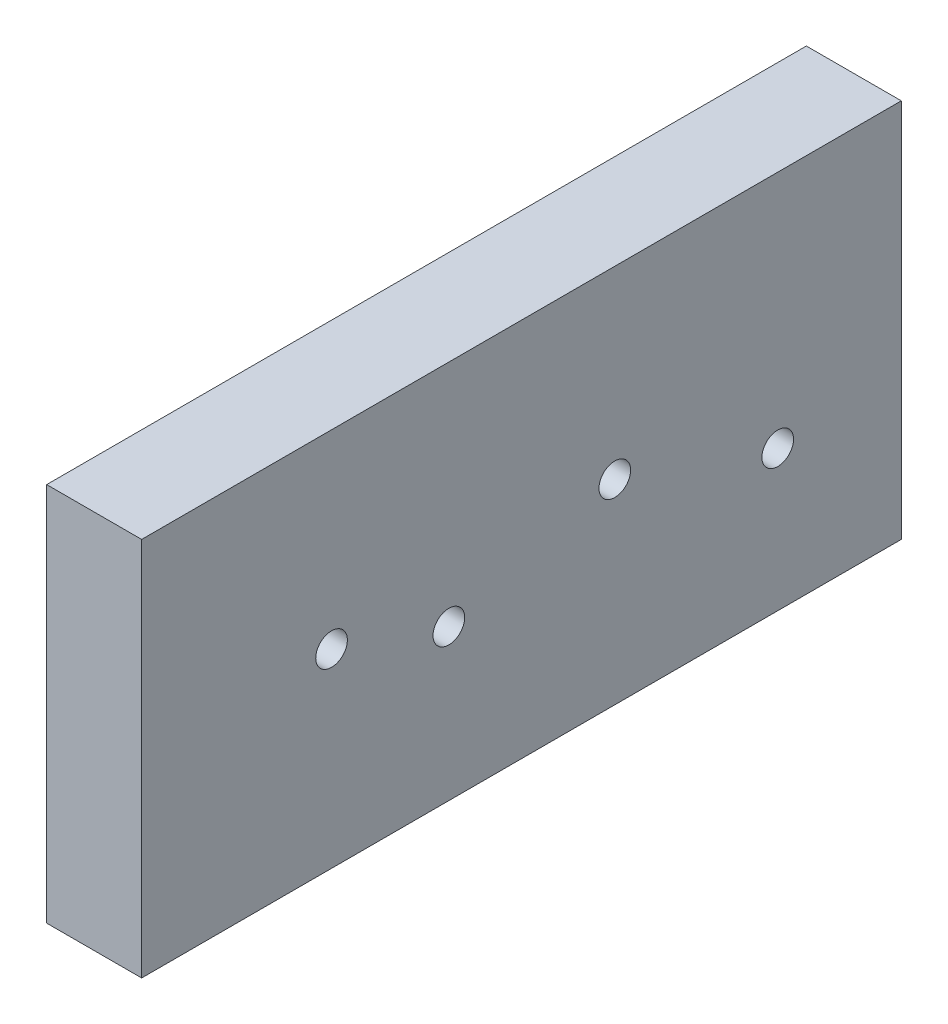
ISO-10303-21;
HEADER;
FILE_DESCRIPTION(('STEP AP214'),'2;1');
FILE_NAME('part.step','',(''),(''),'','','');
FILE_SCHEMA(('AUTOMOTIVE_DESIGN { 1 0 10303 214 1 1 1 1 }'));
ENDSEC;
DATA;
#1=APPLICATION_CONTEXT('core data for automotive mechanical design processes');
#2=APPLICATION_PROTOCOL_DEFINITION('international standard','automotive_design',2000,#1);
#3=PRODUCT_CONTEXT('',#1,'mechanical');
#4=PRODUCT('Part','Part','',(#3));
#5=PRODUCT_RELATED_PRODUCT_CATEGORY('part','',(#4));
#6=PRODUCT_DEFINITION_FORMATION('','',#4);
#7=PRODUCT_DEFINITION_CONTEXT('part definition',#1,'design');
#8=PRODUCT_DEFINITION('design','',#6,#7);
#9=PRODUCT_DEFINITION_SHAPE('','',#8);
#10=(LENGTH_UNIT() NAMED_UNIT(*) SI_UNIT(.MILLI.,.METRE.));
#11=(NAMED_UNIT(*) PLANE_ANGLE_UNIT() SI_UNIT($,.RADIAN.));
#12=(NAMED_UNIT(*) SI_UNIT($,.STERADIAN.) SOLID_ANGLE_UNIT());
#13=UNCERTAINTY_MEASURE_WITH_UNIT(LENGTH_MEASURE(1.E-05),#10,'distance_accuracy_value','');
#14=(GEOMETRIC_REPRESENTATION_CONTEXT(3) GLOBAL_UNCERTAINTY_ASSIGNED_CONTEXT((#13)) GLOBAL_UNIT_ASSIGNED_CONTEXT((#10,
#11,#12)) REPRESENTATION_CONTEXT('',''));
#15=CARTESIAN_POINT('',(0.,0.,0.));
#16=DIRECTION('',(0.,0.,1.));
#17=DIRECTION('',(1.,0.,0.));
#18=AXIS2_PLACEMENT_3D('',#15,#16,#17);
#19=CARTESIAN_POINT('',(19.05,-9.873506971,-51.4082559918149));
#20=DIRECTION('',(-1.,0.,0.));
#21=DIRECTION('',(0.,0.,1.));
#22=AXIS2_PLACEMENT_3D('',#19,#20,#21);
#23=CYLINDRICAL_SURFACE('',#22,3.175);
#24=CARTESIAN_POINT('',(19.05,-9.873506971,-51.4082559918149));
#25=DIRECTION('',(1.,0.,0.));
#26=DIRECTION('',(0.,0.,-1.));
#27=AXIS2_PLACEMENT_3D('',#24,#25,#26);
#28=CIRCLE('',#27,3.175);
#29=CARTESIAN_POINT('',(19.05,-9.873506971,-48.2332559918149));
#30=VERTEX_POINT('',#29);
#31=EDGE_CURVE('E193',#30,#30,#28,.T.);
#32=CARTESIAN_POINT('',(6.35,-9.873506971,-51.4082559918149));
#33=DIRECTION('',(-1.,0.,0.));
#34=DIRECTION('',(0.,0.,1.));
#35=AXIS2_PLACEMENT_3D('',#32,#33,#34);
#36=CIRCLE('',#35,3.175);
#37=CARTESIAN_POINT('',(6.35,-9.873506971,-48.2332559918149));
#38=VERTEX_POINT('',#37);
#39=EDGE_CURVE('E53',#38,#38,#36,.T.);
#40=CARTESIAN_POINT('',(19.05,-9.873506971,-48.2332559918149));
#41=CARTESIAN_POINT('',(18.9177083333333,-9.873506971,-48.2332559918149));
#42=CARTESIAN_POINT('',(18.7854166666667,-9.873506971,-48.2332559918149));
#43=CARTESIAN_POINT('',(18.5208333333333,-9.873506971,-48.2332559918149));
#44=CARTESIAN_POINT('',(18.3885416666667,-9.873506971,-48.2332559918149));
#45=CARTESIAN_POINT('',(18.1239583333333,-9.873506971,-48.2332559918149));
#46=CARTESIAN_POINT('',(17.9916666666667,-9.873506971,-48.2332559918149));
#47=CARTESIAN_POINT('',(17.7270833333333,-9.873506971,-48.2332559918149));
#48=CARTESIAN_POINT('',(17.5947916666667,-9.873506971,-48.2332559918149));
#49=CARTESIAN_POINT('',(17.3302083333333,-9.873506971,-48.2332559918149));
#50=CARTESIAN_POINT('',(17.1979166666667,-9.873506971,-48.2332559918149));
#51=CARTESIAN_POINT('',(16.9333333333333,-9.873506971,-48.2332559918149));
#52=CARTESIAN_POINT('',(16.8010416666667,-9.873506971,-48.2332559918149));
#53=CARTESIAN_POINT('',(16.5364583333333,-9.873506971,-48.2332559918149));
#54=CARTESIAN_POINT('',(16.4041666666667,-9.873506971,-48.2332559918149));
#55=CARTESIAN_POINT('',(16.1395833333333,-9.873506971,-48.2332559918149));
#56=CARTESIAN_POINT('',(16.0072916666667,-9.873506971,-48.2332559918149));
#57=CARTESIAN_POINT('',(15.7427083333333,-9.873506971,-48.2332559918149));
#58=CARTESIAN_POINT('',(15.6104166666667,-9.873506971,-48.2332559918149));
#59=CARTESIAN_POINT('',(15.3458333333333,-9.873506971,-48.2332559918149));
#60=CARTESIAN_POINT('',(15.2135416666667,-9.873506971,-48.2332559918149));
#61=CARTESIAN_POINT('',(14.9489583333333,-9.873506971,-48.2332559918149));
#62=CARTESIAN_POINT('',(14.8166666666667,-9.873506971,-48.2332559918149));
#63=CARTESIAN_POINT('',(14.5520833333333,-9.873506971,-48.2332559918149));
#64=CARTESIAN_POINT('',(14.4197916666667,-9.873506971,-48.2332559918149));
#65=CARTESIAN_POINT('',(14.1552083333333,-9.873506971,-48.2332559918149));
#66=CARTESIAN_POINT('',(14.0229166666667,-9.873506971,-48.2332559918149));
#67=CARTESIAN_POINT('',(13.7583333333333,-9.873506971,-48.2332559918149));
#68=CARTESIAN_POINT('',(13.6260416666667,-9.873506971,-48.2332559918149));
#69=CARTESIAN_POINT('',(13.3614583333333,-9.873506971,-48.2332559918149));
#70=CARTESIAN_POINT('',(13.2291666666667,-9.873506971,-48.2332559918149));
#71=CARTESIAN_POINT('',(12.9645833333333,-9.873506971,-48.2332559918149));
#72=CARTESIAN_POINT('',(12.8322916666667,-9.873506971,-48.2332559918149));
#73=CARTESIAN_POINT('',(12.5677083333333,-9.873506971,-48.2332559918149));
#74=CARTESIAN_POINT('',(12.4354166666667,-9.873506971,-48.2332559918149));
#75=CARTESIAN_POINT('',(12.1708333333333,-9.873506971,-48.2332559918149));
#76=CARTESIAN_POINT('',(12.0385416666667,-9.873506971,-48.2332559918149));
#77=CARTESIAN_POINT('',(11.7739583333333,-9.873506971,-48.2332559918149));
#78=CARTESIAN_POINT('',(11.6416666666667,-9.873506971,-48.2332559918149));
#79=CARTESIAN_POINT('',(11.3770833333333,-9.873506971,-48.2332559918149));
#80=CARTESIAN_POINT('',(11.2447916666667,-9.873506971,-48.2332559918149));
#81=CARTESIAN_POINT('',(10.9802083333333,-9.873506971,-48.2332559918149));
#82=CARTESIAN_POINT('',(10.8479166666667,-9.873506971,-48.2332559918149));
#83=CARTESIAN_POINT('',(10.5833333333333,-9.873506971,-48.2332559918149));
#84=CARTESIAN_POINT('',(10.4510416666667,-9.873506971,-48.2332559918149));
#85=CARTESIAN_POINT('',(10.1864583333333,-9.873506971,-48.2332559918149));
#86=CARTESIAN_POINT('',(10.0541666666667,-9.873506971,-48.2332559918149));
#87=CARTESIAN_POINT('',(9.78958333333333,-9.873506971,-48.2332559918149));
#88=CARTESIAN_POINT('',(9.65729166666667,-9.873506971,-48.2332559918149));
#89=CARTESIAN_POINT('',(9.39270833333333,-9.873506971,-48.2332559918149));
#90=CARTESIAN_POINT('',(9.26041666666667,-9.873506971,-48.2332559918149));
#91=CARTESIAN_POINT('',(8.99583333333333,-9.873506971,-48.2332559918149));
#92=CARTESIAN_POINT('',(8.86354166666667,-9.873506971,-48.2332559918149));
#93=CARTESIAN_POINT('',(8.59895833333333,-9.873506971,-48.2332559918149));
#94=CARTESIAN_POINT('',(8.46666666666667,-9.873506971,-48.2332559918149));
#95=CARTESIAN_POINT('',(8.20208333333333,-9.873506971,-48.2332559918149));
#96=CARTESIAN_POINT('',(8.06979166666667,-9.873506971,-48.2332559918149));
#97=CARTESIAN_POINT('',(7.80520833333333,-9.873506971,-48.2332559918149));
#98=CARTESIAN_POINT('',(7.67291666666667,-9.873506971,-48.2332559918149));
#99=CARTESIAN_POINT('',(7.40833333333333,-9.873506971,-48.2332559918149));
#100=CARTESIAN_POINT('',(7.27604166666667,-9.873506971,-48.2332559918149));
#101=CARTESIAN_POINT('',(7.01145833333333,-9.873506971,-48.2332559918149));
#102=CARTESIAN_POINT('',(6.87916666666667,-9.873506971,-48.2332559918149));
#103=CARTESIAN_POINT('',(6.61458333333333,-9.873506971,-48.2332559918149));
#104=CARTESIAN_POINT('',(6.48229166666667,-9.873506971,-48.2332559918149));
#105=CARTESIAN_POINT('',(6.35,-9.873506971,-48.2332559918149));
#106=B_SPLINE_CURVE_WITH_KNOTS('',3,(#40,#41,#42,#43,#44,#45,#46,#47,#48,#49,#50,#51,#52,#53,
#54,#55,#56,#57,#58,#59,#60,#61,#62,#63,#64,#65,#66,#67,#68,#69,#70,#71,#72,#73,#74,#75,#76,#77,
#78,#79,#80,#81,#82,#83,#84,#85,#86,#87,#88,#89,#90,#91,#92,#93,#94,#95,#96,#97,#98,#99,#100,
#101,#102,#103,#104,#105),.UNSPECIFIED.,.F.,.F.,(4,2,2,2,2,2,2,2,2,2,2,2,2,2,2,2,2,2,2,2,2,2,2,
2,2,2,2,2,2,2,2,2,4),(0.,0.396874999999998,0.793749999999999,1.190625,1.5875,1.984375,2.38125,
2.778125,3.175,3.571875,3.96875,4.365625,4.7625,5.159375,5.55625,5.953125,6.35,6.746875,7.14375,
7.540625,7.9375,8.334375,8.73125,9.128125,9.525,9.921875,10.31875,10.715625,11.1125,11.509375,
11.90625,12.303125,12.7),.UNSPECIFIED.);
#107=EDGE_CURVE('BSEAM49',#30,#38,#106,.T.);
#108=ORIENTED_EDGE('',*,*,#31,.T.);
#109=ORIENTED_EDGE('',*,*,#39,.T.);
#110=ORIENTED_EDGE('',*,*,#107,.T.);
#111=ORIENTED_EDGE('',*,*,#107,.F.);
#112=EDGE_LOOP('',(#108,#110,#109,#111));
#113=FACE_BOUND('',#112,.T.);
#114=ADVANCED_FACE('F49',(#113),#23,.F.);
#115=CARTESIAN_POINT('',(19.05,1.096077429,-18.7225315801618));
#116=DIRECTION('',(-1.,0.,0.));
#117=DIRECTION('',(0.,0.,1.));
#118=AXIS2_PLACEMENT_3D('',#115,#116,#117);
#119=CYLINDRICAL_SURFACE('',#118,3.175);
#120=CARTESIAN_POINT('',(19.05,1.096077429,-18.7225315801618));
#121=DIRECTION('',(1.,0.,0.));
#122=DIRECTION('',(0.,0.,-1.));
#123=AXIS2_PLACEMENT_3D('',#120,#121,#122);
#124=CIRCLE('',#123,3.175);
#125=CARTESIAN_POINT('',(19.05,1.096077429,-15.5475315801618));
#126=VERTEX_POINT('',#125);
#127=EDGE_CURVE('E189',#126,#126,#124,.T.);
#128=CARTESIAN_POINT('',(6.35,1.096077429,-18.7225315801618));
#129=DIRECTION('',(-1.,0.,0.));
#130=DIRECTION('',(0.,0.,1.));
#131=AXIS2_PLACEMENT_3D('',#128,#129,#130);
#132=CIRCLE('',#131,3.175);
#133=CARTESIAN_POINT('',(6.35,1.096077429,-15.5475315801618));
#134=VERTEX_POINT('',#133);
#135=EDGE_CURVE('E227',#134,#134,#132,.T.);
#136=CARTESIAN_POINT('',(19.05,1.096077429,-15.5475315801618));
#137=CARTESIAN_POINT('',(18.9177083333333,1.096077429,-15.5475315801618));
#138=CARTESIAN_POINT('',(18.7854166666667,1.096077429,-15.5475315801618));
#139=CARTESIAN_POINT('',(18.5208333333333,1.096077429,-15.5475315801618));
#140=CARTESIAN_POINT('',(18.3885416666667,1.096077429,-15.5475315801618));
#141=CARTESIAN_POINT('',(18.1239583333333,1.096077429,-15.5475315801618));
#142=CARTESIAN_POINT('',(17.9916666666667,1.096077429,-15.5475315801618));
#143=CARTESIAN_POINT('',(17.7270833333333,1.096077429,-15.5475315801618));
#144=CARTESIAN_POINT('',(17.5947916666667,1.096077429,-15.5475315801618));
#145=CARTESIAN_POINT('',(17.3302083333333,1.096077429,-15.5475315801618));
#146=CARTESIAN_POINT('',(17.1979166666667,1.096077429,-15.5475315801618));
#147=CARTESIAN_POINT('',(16.9333333333333,1.096077429,-15.5475315801618));
#148=CARTESIAN_POINT('',(16.8010416666667,1.096077429,-15.5475315801618));
#149=CARTESIAN_POINT('',(16.5364583333333,1.096077429,-15.5475315801618));
#150=CARTESIAN_POINT('',(16.4041666666667,1.096077429,-15.5475315801618));
#151=CARTESIAN_POINT('',(16.1395833333333,1.096077429,-15.5475315801618));
#152=CARTESIAN_POINT('',(16.0072916666667,1.096077429,-15.5475315801618));
#153=CARTESIAN_POINT('',(15.7427083333333,1.096077429,-15.5475315801618));
#154=CARTESIAN_POINT('',(15.6104166666667,1.096077429,-15.5475315801618));
#155=CARTESIAN_POINT('',(15.3458333333333,1.096077429,-15.5475315801618));
#156=CARTESIAN_POINT('',(15.2135416666667,1.096077429,-15.5475315801618));
#157=CARTESIAN_POINT('',(14.9489583333333,1.096077429,-15.5475315801618));
#158=CARTESIAN_POINT('',(14.8166666666667,1.096077429,-15.5475315801618));
#159=CARTESIAN_POINT('',(14.5520833333333,1.096077429,-15.5475315801618));
#160=CARTESIAN_POINT('',(14.4197916666667,1.096077429,-15.5475315801618));
#161=CARTESIAN_POINT('',(14.1552083333333,1.096077429,-15.5475315801618));
#162=CARTESIAN_POINT('',(14.0229166666667,1.096077429,-15.5475315801618));
#163=CARTESIAN_POINT('',(13.7583333333333,1.096077429,-15.5475315801618));
#164=CARTESIAN_POINT('',(13.6260416666667,1.096077429,-15.5475315801618));
#165=CARTESIAN_POINT('',(13.3614583333333,1.096077429,-15.5475315801618));
#166=CARTESIAN_POINT('',(13.2291666666667,1.096077429,-15.5475315801618));
#167=CARTESIAN_POINT('',(12.9645833333333,1.096077429,-15.5475315801618));
#168=CARTESIAN_POINT('',(12.8322916666667,1.096077429,-15.5475315801618));
#169=CARTESIAN_POINT('',(12.5677083333333,1.096077429,-15.5475315801618));
#170=CARTESIAN_POINT('',(12.4354166666667,1.096077429,-15.5475315801618));
#171=CARTESIAN_POINT('',(12.1708333333333,1.096077429,-15.5475315801618));
#172=CARTESIAN_POINT('',(12.0385416666667,1.096077429,-15.5475315801618));
#173=CARTESIAN_POINT('',(11.7739583333333,1.096077429,-15.5475315801618));
#174=CARTESIAN_POINT('',(11.6416666666667,1.096077429,-15.5475315801618));
#175=CARTESIAN_POINT('',(11.3770833333333,1.096077429,-15.5475315801618));
#176=CARTESIAN_POINT('',(11.2447916666667,1.096077429,-15.5475315801618));
#177=CARTESIAN_POINT('',(10.9802083333333,1.096077429,-15.5475315801618));
#178=CARTESIAN_POINT('',(10.8479166666667,1.096077429,-15.5475315801618));
#179=CARTESIAN_POINT('',(10.5833333333333,1.096077429,-15.5475315801618));
#180=CARTESIAN_POINT('',(10.4510416666667,1.096077429,-15.5475315801618));
#181=CARTESIAN_POINT('',(10.1864583333333,1.096077429,-15.5475315801618));
#182=CARTESIAN_POINT('',(10.0541666666667,1.096077429,-15.5475315801618));
#183=CARTESIAN_POINT('',(9.78958333333333,1.096077429,-15.5475315801618));
#184=CARTESIAN_POINT('',(9.65729166666667,1.096077429,-15.5475315801618));
#185=CARTESIAN_POINT('',(9.39270833333333,1.096077429,-15.5475315801618));
#186=CARTESIAN_POINT('',(9.26041666666667,1.096077429,-15.5475315801618));
#187=CARTESIAN_POINT('',(8.99583333333333,1.096077429,-15.5475315801618));
#188=CARTESIAN_POINT('',(8.86354166666667,1.096077429,-15.5475315801618));
#189=CARTESIAN_POINT('',(8.59895833333333,1.096077429,-15.5475315801618));
#190=CARTESIAN_POINT('',(8.46666666666667,1.096077429,-15.5475315801618));
#191=CARTESIAN_POINT('',(8.20208333333333,1.096077429,-15.5475315801618));
#192=CARTESIAN_POINT('',(8.06979166666667,1.096077429,-15.5475315801618));
#193=CARTESIAN_POINT('',(7.80520833333333,1.096077429,-15.5475315801618));
#194=CARTESIAN_POINT('',(7.67291666666667,1.096077429,-15.5475315801618));
#195=CARTESIAN_POINT('',(7.40833333333333,1.096077429,-15.5475315801618));
#196=CARTESIAN_POINT('',(7.27604166666667,1.096077429,-15.5475315801618));
#197=CARTESIAN_POINT('',(7.01145833333333,1.096077429,-15.5475315801618));
#198=CARTESIAN_POINT('',(6.87916666666667,1.096077429,-15.5475315801618));
#199=CARTESIAN_POINT('',(6.61458333333333,1.096077429,-15.5475315801618));
#200=CARTESIAN_POINT('',(6.48229166666667,1.096077429,-15.5475315801618));
#201=CARTESIAN_POINT('',(6.35,1.096077429,-15.5475315801618));
#202=B_SPLINE_CURVE_WITH_KNOTS('',3,(#136,#137,#138,#139,#140,#141,#142,#143,#144,#145,#146,
#147,#148,#149,#150,#151,#152,#153,#154,#155,#156,#157,#158,#159,#160,#161,#162,#163,#164,#165,
#166,#167,#168,#169,#170,#171,#172,#173,#174,#175,#176,#177,#178,#179,#180,#181,#182,#183,#184,
#185,#186,#187,#188,#189,#190,#191,#192,#193,#194,#195,#196,#197,#198,#199,#200,#201),
.UNSPECIFIED.,.F.,.F.,(4,2,2,2,2,2,2,2,2,2,2,2,2,2,2,2,2,2,2,2,2,2,2,2,2,2,2,2,2,2,2,2,4),(0.,
0.396874999999998,0.793749999999999,1.190625,1.5875,1.984375,2.38125,2.778125,3.175,3.571875,
3.96875,4.365625,4.7625,5.159375,5.55625,5.953125,6.35,6.746875,7.14375,7.540625,7.9375,
8.334375,8.73125,9.128125,9.525,9.921875,10.31875,10.715625,11.1125,11.509375,11.90625,
12.303125,12.7),.UNSPECIFIED.);
#203=EDGE_CURVE('BSEAM271',#126,#134,#202,.T.);
#204=ORIENTED_EDGE('',*,*,#127,.T.);
#205=ORIENTED_EDGE('',*,*,#135,.T.);
#206=ORIENTED_EDGE('',*,*,#203,.T.);
#207=ORIENTED_EDGE('',*,*,#203,.F.);
#208=EDGE_LOOP('',(#204,#206,#205,#207));
#209=FACE_BOUND('',#208,.T.);
#210=ADVANCED_FACE('F271',(#209),#119,.F.);
#211=CARTESIAN_POINT('',(19.05,0.,38.1));
#212=DIRECTION('',(-1.,0.,0.));
#213=DIRECTION('',(0.,0.,1.));
#214=AXIS2_PLACEMENT_3D('',#211,#212,#213);
#215=CYLINDRICAL_SURFACE('',#214,3.175);
#216=CARTESIAN_POINT('',(19.05,0.,38.1));
#217=DIRECTION('',(1.,0.,0.));
#218=DIRECTION('',(0.,0.,-1.));
#219=AXIS2_PLACEMENT_3D('',#216,#217,#218);
#220=CIRCLE('',#219,3.175);
#221=CARTESIAN_POINT('',(19.05,0.,41.275));
#222=VERTEX_POINT('',#221);
#223=EDGE_CURVE('E185',#222,#222,#220,.T.);
#224=CARTESIAN_POINT('',(6.35,0.,38.1));
#225=DIRECTION('',(-1.,0.,0.));
#226=DIRECTION('',(0.,0.,1.));
#227=AXIS2_PLACEMENT_3D('',#224,#225,#226);
#228=CIRCLE('',#227,3.175);
#229=CARTESIAN_POINT('',(6.35,0.,41.275));
#230=VERTEX_POINT('',#229);
#231=EDGE_CURVE('E224',#230,#230,#228,.T.);
#232=CARTESIAN_POINT('',(19.05,0.,41.275));
#233=CARTESIAN_POINT('',(18.9177083333333,0.,41.275));
#234=CARTESIAN_POINT('',(18.7854166666667,0.,41.275));
#235=CARTESIAN_POINT('',(18.5208333333333,0.,41.275));
#236=CARTESIAN_POINT('',(18.3885416666667,0.,41.275));
#237=CARTESIAN_POINT('',(18.1239583333333,0.,41.275));
#238=CARTESIAN_POINT('',(17.9916666666667,0.,41.275));
#239=CARTESIAN_POINT('',(17.7270833333333,0.,41.275));
#240=CARTESIAN_POINT('',(17.5947916666667,0.,41.275));
#241=CARTESIAN_POINT('',(17.3302083333333,0.,41.275));
#242=CARTESIAN_POINT('',(17.1979166666667,0.,41.275));
#243=CARTESIAN_POINT('',(16.9333333333333,0.,41.275));
#244=CARTESIAN_POINT('',(16.8010416666667,0.,41.275));
#245=CARTESIAN_POINT('',(16.5364583333333,0.,41.275));
#246=CARTESIAN_POINT('',(16.4041666666667,0.,41.275));
#247=CARTESIAN_POINT('',(16.1395833333333,0.,41.275));
#248=CARTESIAN_POINT('',(16.0072916666667,0.,41.275));
#249=CARTESIAN_POINT('',(15.7427083333333,0.,41.275));
#250=CARTESIAN_POINT('',(15.6104166666667,0.,41.275));
#251=CARTESIAN_POINT('',(15.3458333333333,0.,41.275));
#252=CARTESIAN_POINT('',(15.2135416666667,0.,41.275));
#253=CARTESIAN_POINT('',(14.9489583333333,0.,41.275));
#254=CARTESIAN_POINT('',(14.8166666666667,0.,41.275));
#255=CARTESIAN_POINT('',(14.5520833333333,0.,41.275));
#256=CARTESIAN_POINT('',(14.4197916666667,0.,41.275));
#257=CARTESIAN_POINT('',(14.1552083333333,0.,41.275));
#258=CARTESIAN_POINT('',(14.0229166666667,0.,41.275));
#259=CARTESIAN_POINT('',(13.7583333333333,0.,41.275));
#260=CARTESIAN_POINT('',(13.6260416666667,0.,41.275));
#261=CARTESIAN_POINT('',(13.3614583333333,0.,41.275));
#262=CARTESIAN_POINT('',(13.2291666666667,0.,41.275));
#263=CARTESIAN_POINT('',(12.9645833333333,0.,41.275));
#264=CARTESIAN_POINT('',(12.8322916666667,0.,41.275));
#265=CARTESIAN_POINT('',(12.5677083333333,0.,41.275));
#266=CARTESIAN_POINT('',(12.4354166666667,0.,41.275));
#267=CARTESIAN_POINT('',(12.1708333333333,0.,41.275));
#268=CARTESIAN_POINT('',(12.0385416666667,0.,41.275));
#269=CARTESIAN_POINT('',(11.7739583333333,0.,41.275));
#270=CARTESIAN_POINT('',(11.6416666666667,0.,41.275));
#271=CARTESIAN_POINT('',(11.3770833333333,0.,41.275));
#272=CARTESIAN_POINT('',(11.2447916666667,0.,41.275));
#273=CARTESIAN_POINT('',(10.9802083333333,0.,41.275));
#274=CARTESIAN_POINT('',(10.8479166666667,0.,41.275));
#275=CARTESIAN_POINT('',(10.5833333333333,0.,41.275));
#276=CARTESIAN_POINT('',(10.4510416666667,0.,41.275));
#277=CARTESIAN_POINT('',(10.1864583333333,0.,41.275));
#278=CARTESIAN_POINT('',(10.0541666666667,0.,41.275));
#279=CARTESIAN_POINT('',(9.78958333333333,0.,41.275));
#280=CARTESIAN_POINT('',(9.65729166666667,0.,41.275));
#281=CARTESIAN_POINT('',(9.39270833333333,0.,41.275));
#282=CARTESIAN_POINT('',(9.26041666666667,0.,41.275));
#283=CARTESIAN_POINT('',(8.99583333333333,0.,41.275));
#284=CARTESIAN_POINT('',(8.86354166666667,0.,41.275));
#285=CARTESIAN_POINT('',(8.59895833333333,0.,41.275));
#286=CARTESIAN_POINT('',(8.46666666666667,0.,41.275));
#287=CARTESIAN_POINT('',(8.20208333333333,0.,41.275));
#288=CARTESIAN_POINT('',(8.06979166666667,0.,41.275));
#289=CARTESIAN_POINT('',(7.80520833333333,0.,41.275));
#290=CARTESIAN_POINT('',(7.67291666666667,0.,41.275));
#291=CARTESIAN_POINT('',(7.40833333333333,0.,41.275));
#292=CARTESIAN_POINT('',(7.27604166666667,0.,41.275));
#293=CARTESIAN_POINT('',(7.01145833333333,0.,41.275));
#294=CARTESIAN_POINT('',(6.87916666666667,0.,41.275));
#295=CARTESIAN_POINT('',(6.61458333333333,0.,41.275));
#296=CARTESIAN_POINT('',(6.48229166666667,0.,41.275));
#297=CARTESIAN_POINT('',(6.35,0.,41.275));
#298=B_SPLINE_CURVE_WITH_KNOTS('',3,(#232,#233,#234,#235,#236,#237,#238,#239,#240,#241,#242,
#243,#244,#245,#246,#247,#248,#249,#250,#251,#252,#253,#254,#255,#256,#257,#258,#259,#260,#261,
#262,#263,#264,#265,#266,#267,#268,#269,#270,#271,#272,#273,#274,#275,#276,#277,#278,#279,#280,
#281,#282,#283,#284,#285,#286,#287,#288,#289,#290,#291,#292,#293,#294,#295,#296,#297),
.UNSPECIFIED.,.F.,.F.,(4,2,2,2,2,2,2,2,2,2,2,2,2,2,2,2,2,2,2,2,2,2,2,2,2,2,2,2,2,2,2,2,4),(0.,
0.396874999999998,0.793749999999999,1.190625,1.5875,1.984375,2.38125,2.778125,3.175,3.571875,
3.96875,4.365625,4.7625,5.159375,5.55625,5.953125,6.35,6.746875,7.14375,7.540625,7.9375,
8.334375,8.73125,9.128125,9.525,9.921875,10.31875,10.715625,11.1125,11.509375,11.90625,
12.303125,12.7),.UNSPECIFIED.);
#299=EDGE_CURVE('BSEAM278',#222,#230,#298,.T.);
#300=ORIENTED_EDGE('',*,*,#223,.T.);
#301=ORIENTED_EDGE('',*,*,#231,.T.);
#302=ORIENTED_EDGE('',*,*,#299,.T.);
#303=ORIENTED_EDGE('',*,*,#299,.F.);
#304=EDGE_LOOP('',(#300,#302,#301,#303));
#305=FACE_BOUND('',#304,.T.);
#306=ADVANCED_FACE('F278',(#305),#215,.F.);
#307=CARTESIAN_POINT('',(19.05,-7.860160654,14.5712240149026));
#308=DIRECTION('',(-1.,0.,0.));
#309=DIRECTION('',(0.,0.,1.));
#310=AXIS2_PLACEMENT_3D('',#307,#308,#309);
#311=CYLINDRICAL_SURFACE('',#310,3.17500000000001);
#312=CARTESIAN_POINT('',(19.05,-7.860160654,14.5712240149026));
#313=DIRECTION('',(1.,0.,0.));
#314=DIRECTION('',(0.,0.,-1.));
#315=AXIS2_PLACEMENT_3D('',#312,#313,#314);
#316=CIRCLE('',#315,3.17500000000001);
#317=CARTESIAN_POINT('',(19.05,-7.860160654,17.7462240149026));
#318=VERTEX_POINT('',#317);
#319=EDGE_CURVE('E197',#318,#318,#316,.T.);
#320=CARTESIAN_POINT('',(6.35,-7.860160654,14.5712240149026));
#321=DIRECTION('',(-1.,0.,0.));
#322=DIRECTION('',(0.,0.,1.));
#323=AXIS2_PLACEMENT_3D('',#320,#321,#322);
#324=CIRCLE('',#323,3.17500000000001);
#325=CARTESIAN_POINT('',(6.35,-7.860160654,17.7462240149026));
#326=VERTEX_POINT('',#325);
#327=EDGE_CURVE('E144',#326,#326,#324,.T.);
#328=CARTESIAN_POINT('',(19.05,-7.860160654,17.7462240149026));
#329=CARTESIAN_POINT('',(18.9177083333333,-7.860160654,17.7462240149026));
#330=CARTESIAN_POINT('',(18.7854166666667,-7.860160654,17.7462240149026));
#331=CARTESIAN_POINT('',(18.5208333333333,-7.860160654,17.7462240149026));
#332=CARTESIAN_POINT('',(18.3885416666667,-7.860160654,17.7462240149026));
#333=CARTESIAN_POINT('',(18.1239583333333,-7.860160654,17.7462240149026));
#334=CARTESIAN_POINT('',(17.9916666666667,-7.860160654,17.7462240149026));
#335=CARTESIAN_POINT('',(17.7270833333333,-7.860160654,17.7462240149026));
#336=CARTESIAN_POINT('',(17.5947916666667,-7.860160654,17.7462240149026));
#337=CARTESIAN_POINT('',(17.3302083333333,-7.860160654,17.7462240149026));
#338=CARTESIAN_POINT('',(17.1979166666667,-7.860160654,17.7462240149026));
#339=CARTESIAN_POINT('',(16.9333333333333,-7.860160654,17.7462240149026));
#340=CARTESIAN_POINT('',(16.8010416666667,-7.860160654,17.7462240149026));
#341=CARTESIAN_POINT('',(16.5364583333333,-7.860160654,17.7462240149026));
#342=CARTESIAN_POINT('',(16.4041666666667,-7.860160654,17.7462240149026));
#343=CARTESIAN_POINT('',(16.1395833333333,-7.860160654,17.7462240149026));
#344=CARTESIAN_POINT('',(16.0072916666667,-7.860160654,17.7462240149026));
#345=CARTESIAN_POINT('',(15.7427083333333,-7.860160654,17.7462240149026));
#346=CARTESIAN_POINT('',(15.6104166666667,-7.860160654,17.7462240149026));
#347=CARTESIAN_POINT('',(15.3458333333333,-7.860160654,17.7462240149026));
#348=CARTESIAN_POINT('',(15.2135416666667,-7.860160654,17.7462240149026));
#349=CARTESIAN_POINT('',(14.9489583333333,-7.860160654,17.7462240149026));
#350=CARTESIAN_POINT('',(14.8166666666667,-7.860160654,17.7462240149026));
#351=CARTESIAN_POINT('',(14.5520833333333,-7.860160654,17.7462240149026));
#352=CARTESIAN_POINT('',(14.4197916666667,-7.860160654,17.7462240149026));
#353=CARTESIAN_POINT('',(14.1552083333333,-7.860160654,17.7462240149026));
#354=CARTESIAN_POINT('',(14.0229166666667,-7.860160654,17.7462240149026));
#355=CARTESIAN_POINT('',(13.7583333333333,-7.860160654,17.7462240149026));
#356=CARTESIAN_POINT('',(13.6260416666667,-7.860160654,17.7462240149026));
#357=CARTESIAN_POINT('',(13.3614583333333,-7.860160654,17.7462240149026));
#358=CARTESIAN_POINT('',(13.2291666666667,-7.860160654,17.7462240149026));
#359=CARTESIAN_POINT('',(12.9645833333333,-7.860160654,17.7462240149026));
#360=CARTESIAN_POINT('',(12.8322916666667,-7.860160654,17.7462240149026));
#361=CARTESIAN_POINT('',(12.5677083333333,-7.860160654,17.7462240149026));
#362=CARTESIAN_POINT('',(12.4354166666667,-7.860160654,17.7462240149026));
#363=CARTESIAN_POINT('',(12.1708333333333,-7.860160654,17.7462240149026));
#364=CARTESIAN_POINT('',(12.0385416666667,-7.860160654,17.7462240149026));
#365=CARTESIAN_POINT('',(11.7739583333333,-7.860160654,17.7462240149026));
#366=CARTESIAN_POINT('',(11.6416666666667,-7.860160654,17.7462240149026));
#367=CARTESIAN_POINT('',(11.3770833333333,-7.860160654,17.7462240149026));
#368=CARTESIAN_POINT('',(11.2447916666667,-7.860160654,17.7462240149026));
#369=CARTESIAN_POINT('',(10.9802083333333,-7.860160654,17.7462240149026));
#370=CARTESIAN_POINT('',(10.8479166666667,-7.860160654,17.7462240149026));
#371=CARTESIAN_POINT('',(10.5833333333333,-7.860160654,17.7462240149026));
#372=CARTESIAN_POINT('',(10.4510416666667,-7.860160654,17.7462240149026));
#373=CARTESIAN_POINT('',(10.1864583333333,-7.860160654,17.7462240149026));
#374=CARTESIAN_POINT('',(10.0541666666667,-7.860160654,17.7462240149026));
#375=CARTESIAN_POINT('',(9.78958333333333,-7.860160654,17.7462240149026));
#376=CARTESIAN_POINT('',(9.65729166666667,-7.860160654,17.7462240149026));
#377=CARTESIAN_POINT('',(9.39270833333333,-7.860160654,17.7462240149026));
#378=CARTESIAN_POINT('',(9.26041666666667,-7.860160654,17.7462240149026));
#379=CARTESIAN_POINT('',(8.99583333333333,-7.860160654,17.7462240149026));
#380=CARTESIAN_POINT('',(8.86354166666667,-7.860160654,17.7462240149026));
#381=CARTESIAN_POINT('',(8.59895833333333,-7.860160654,17.7462240149026));
#382=CARTESIAN_POINT('',(8.46666666666667,-7.860160654,17.7462240149026));
#383=CARTESIAN_POINT('',(8.20208333333333,-7.860160654,17.7462240149026));
#384=CARTESIAN_POINT('',(8.06979166666667,-7.860160654,17.7462240149026));
#385=CARTESIAN_POINT('',(7.80520833333333,-7.860160654,17.7462240149026));
#386=CARTESIAN_POINT('',(7.67291666666667,-7.860160654,17.7462240149026));
#387=CARTESIAN_POINT('',(7.40833333333333,-7.860160654,17.7462240149026));
#388=CARTESIAN_POINT('',(7.27604166666667,-7.860160654,17.7462240149026));
#389=CARTESIAN_POINT('',(7.01145833333333,-7.860160654,17.7462240149026));
#390=CARTESIAN_POINT('',(6.87916666666667,-7.860160654,17.7462240149026));
#391=CARTESIAN_POINT('',(6.61458333333333,-7.860160654,17.7462240149026));
#392=CARTESIAN_POINT('',(6.48229166666667,-7.860160654,17.7462240149026));
#393=CARTESIAN_POINT('',(6.35,-7.860160654,17.7462240149026));
#394=B_SPLINE_CURVE_WITH_KNOTS('',3,(#328,#329,#330,#331,#332,#333,#334,#335,#336,#337,#338,
#339,#340,#341,#342,#343,#344,#345,#346,#347,#348,#349,#350,#351,#352,#353,#354,#355,#356,#357,
#358,#359,#360,#361,#362,#363,#364,#365,#366,#367,#368,#369,#370,#371,#372,#373,#374,#375,#376,
#377,#378,#379,#380,#381,#382,#383,#384,#385,#386,#387,#388,#389,#390,#391,#392,#393),
.UNSPECIFIED.,.F.,.F.,(4,2,2,2,2,2,2,2,2,2,2,2,2,2,2,2,2,2,2,2,2,2,2,2,2,2,2,2,2,2,2,2,4),(0.,
0.396874999999998,0.793749999999999,1.190625,1.5875,1.984375,2.38125,2.778125,3.175,3.571875,
3.96875,4.365625,4.7625,5.159375,5.55625,5.953125,6.35,6.746875,7.14375,7.540625,7.9375,
8.334375,8.73125,9.128125,9.525,9.921875,10.31875,10.715625,11.1125,11.509375,11.90625,
12.303125,12.7),.UNSPECIFIED.);
#395=EDGE_CURVE('BSEAM282',#318,#326,#394,.T.);
#396=ORIENTED_EDGE('',*,*,#319,.T.);
#397=ORIENTED_EDGE('',*,*,#327,.T.);
#398=ORIENTED_EDGE('',*,*,#395,.T.);
#399=ORIENTED_EDGE('',*,*,#395,.F.);
#400=EDGE_LOOP('',(#396,#398,#397,#399));
#401=FACE_BOUND('',#400,.T.);
#402=ADVANCED_FACE('F282',(#401),#311,.F.);
#403=CARTESIAN_POINT('',(19.05,-38.1,0.));
#404=DIRECTION('',(0.,1.,0.));
#405=DIRECTION('',(0.,0.,1.));
#406=AXIS2_PLACEMENT_3D('',#403,#404,#405);
#407=PLANE('',#406);
#408=CARTESIAN_POINT('',(9.525,-38.1,0.));
#409=DIRECTION('',(0.,-1.,0.));
#410=DIRECTION('',(0.,0.,-1.));
#411=AXIS2_PLACEMENT_3D('',#408,#409,#410);
#412=CIRCLE('',#411,3.17499999999999);
#413=CARTESIAN_POINT('',(9.525,-38.1,-3.17499999999997));
#414=VERTEX_POINT('',#413);
#415=EDGE_CURVE('E118',#414,#414,#412,.T.);
#416=ORIENTED_EDGE('',*,*,#415,.F.);
#417=EDGE_LOOP('',(#416));
#418=FACE_BOUND('',#417,.T.);
#419=CARTESIAN_POINT('',(9.525,-38.1,57.15));
#420=DIRECTION('',(0.,-1.,0.));
#421=DIRECTION('',(0.,0.,-1.));
#422=AXIS2_PLACEMENT_3D('',#419,#420,#421);
#423=CIRCLE('',#422,3.17499999999999);
#424=CARTESIAN_POINT('',(9.525,-38.1,53.975));
#425=VERTEX_POINT('',#424);
#426=EDGE_CURVE('E117',#425,#425,#423,.T.);
#427=ORIENTED_EDGE('',*,*,#426,.F.);
#428=EDGE_LOOP('',(#427));
#429=FACE_BOUND('',#428,.T.);
#430=CARTESIAN_POINT('',(9.52500000000002,-38.1,-63.5));
#431=DIRECTION('',(0.,-1.,0.));
#432=DIRECTION('',(0.,0.,-1.));
#433=AXIS2_PLACEMENT_3D('',#430,#431,#432);
#434=CIRCLE('',#433,3.17499999999999);
#435=CARTESIAN_POINT('',(9.52500000000002,-38.1,-66.675));
#436=VERTEX_POINT('',#435);
#437=EDGE_CURVE('E131',#436,#436,#434,.T.);
#438=ORIENTED_EDGE('',*,*,#437,.F.);
#439=EDGE_LOOP('',(#438));
#440=FACE_BOUND('',#439,.T.);
#441=DIRECTION('',(0.,0.,-1.));
#442=VECTOR('',#441,1.);
#443=CARTESIAN_POINT('',(0.,-38.1,0.));
#444=LINE('',#443,#442);
#445=CARTESIAN_POINT('',(0.,-38.1,76.2));
#446=VERTEX_POINT('',#445);
#447=CARTESIAN_POINT('',(0.,-38.1,-76.2));
#448=VERTEX_POINT('',#447);
#449=EDGE_CURVE('E201',#446,#448,#444,.T.);
#450=ORIENTED_EDGE('',*,*,#449,.T.);
#451=DIRECTION('',(-1.,0.,0.));
#452=VECTOR('',#451,1.);
#453=CARTESIAN_POINT('',(19.05,-38.1,-76.2));
#454=LINE('',#453,#452);
#455=CARTESIAN_POINT('',(19.05,-38.1,-76.2));
#456=VERTEX_POINT('',#455);
#457=EDGE_CURVE('E11',#456,#448,#454,.T.);
#458=ORIENTED_EDGE('',*,*,#457,.F.);
#459=DIRECTION('',(0.,0.,-1.));
#460=VECTOR('',#459,1.);
#461=CARTESIAN_POINT('',(19.05,-38.1,0.));
#462=LINE('',#461,#460);
#463=CARTESIAN_POINT('',(19.05,-38.1,76.2));
#464=VERTEX_POINT('',#463);
#465=EDGE_CURVE('E172',#464,#456,#462,.T.);
#466=ORIENTED_EDGE('',*,*,#465,.F.);
#467=DIRECTION('',(-1.,0.,0.));
#468=VECTOR('',#467,1.);
#469=CARTESIAN_POINT('',(19.05,-38.1,76.2));
#470=LINE('',#469,#468);
#471=EDGE_CURVE('E69',#464,#446,#470,.T.);
#472=ORIENTED_EDGE('',*,*,#471,.T.);
#473=EDGE_LOOP('',(#450,#458,#466,#472));
#474=FACE_BOUND('',#473,.T.);
#475=ADVANCED_FACE('F51',(#418,#429,#440,#474),#407,.F.);
#476=CARTESIAN_POINT('',(19.05,0.,-76.2));
#477=DIRECTION('',(0.,0.,1.));
#478=DIRECTION('',(1.,0.,0.));
#479=AXIS2_PLACEMENT_3D('',#476,#477,#478);
#480=PLANE('',#479);
#481=DIRECTION('',(0.,1.,0.));
#482=VECTOR('',#481,1.);
#483=CARTESIAN_POINT('',(0.,0.,-76.2));
#484=LINE('',#483,#482);
#485=CARTESIAN_POINT('',(0.,38.1,-76.2));
#486=VERTEX_POINT('',#485);
#487=EDGE_CURVE('E204',#448,#486,#484,.T.);
#488=ORIENTED_EDGE('',*,*,#487,.T.);
#489=DIRECTION('',(-1.,0.,0.));
#490=VECTOR('',#489,1.);
#491=CARTESIAN_POINT('',(19.05,38.1,-76.2));
#492=LINE('',#491,#490);
#493=CARTESIAN_POINT('',(19.05,38.1,-76.2));
#494=VERTEX_POINT('',#493);
#495=EDGE_CURVE('E60',#494,#486,#492,.T.);
#496=ORIENTED_EDGE('',*,*,#495,.F.);
#497=DIRECTION('',(0.,1.,0.));
#498=VECTOR('',#497,1.);
#499=CARTESIAN_POINT('',(19.05,0.,-76.2));
#500=LINE('',#499,#498);
#501=EDGE_CURVE('E95',#456,#494,#500,.T.);
#502=ORIENTED_EDGE('',*,*,#501,.F.);
#503=ORIENTED_EDGE('',*,*,#457,.T.);
#504=EDGE_LOOP('',(#488,#496,#502,#503));
#505=FACE_BOUND('',#504,.T.);
#506=ADVANCED_FACE('F266',(#505),#480,.F.);
#507=CARTESIAN_POINT('',(19.05,38.1,0.));
#508=DIRECTION('',(0.,1.,0.));
#509=DIRECTION('',(0.,0.,1.));
#510=AXIS2_PLACEMENT_3D('',#507,#508,#509);
#511=PLANE('',#510);
#512=DIRECTION('',(0.,0.,-1.));
#513=VECTOR('',#512,1.);
#514=CARTESIAN_POINT('',(0.,38.1,0.));
#515=LINE('',#514,#513);
#516=CARTESIAN_POINT('',(0.,38.1,76.2));
#517=VERTEX_POINT('',#516);
#518=EDGE_CURVE('E208',#517,#486,#515,.T.);
#519=ORIENTED_EDGE('',*,*,#518,.F.);
#520=DIRECTION('',(-1.,0.,0.));
#521=VECTOR('',#520,1.);
#522=CARTESIAN_POINT('',(19.05,38.1,76.2));
#523=LINE('',#522,#521);
#524=CARTESIAN_POINT('',(19.05,38.1,76.2));
#525=VERTEX_POINT('',#524);
#526=EDGE_CURVE('E84',#525,#517,#523,.T.);
#527=ORIENTED_EDGE('',*,*,#526,.F.);
#528=DIRECTION('',(0.,0.,-1.));
#529=VECTOR('',#528,1.);
#530=CARTESIAN_POINT('',(19.05,38.1,0.));
#531=LINE('',#530,#529);
#532=EDGE_CURVE('E178',#525,#494,#531,.T.);
#533=ORIENTED_EDGE('',*,*,#532,.T.);
#534=ORIENTED_EDGE('',*,*,#495,.T.);
#535=EDGE_LOOP('',(#519,#527,#533,#534));
#536=FACE_BOUND('',#535,.T.);
#537=ADVANCED_FACE('F259',(#536),#511,.T.);
#538=CARTESIAN_POINT('',(19.05,0.,76.2));
#539=DIRECTION('',(0.,0.,1.));
#540=DIRECTION('',(1.,0.,0.));
#541=AXIS2_PLACEMENT_3D('',#538,#539,#540);
#542=PLANE('',#541);
#543=DIRECTION('',(0.,1.,0.));
#544=VECTOR('',#543,1.);
#545=CARTESIAN_POINT('',(0.,0.,76.2));
#546=LINE('',#545,#544);
#547=EDGE_CURVE('E175',#446,#517,#546,.T.);
#548=ORIENTED_EDGE('',*,*,#547,.F.);
#549=ORIENTED_EDGE('',*,*,#471,.F.);
#550=DIRECTION('',(0.,1.,0.));
#551=VECTOR('',#550,1.);
#552=CARTESIAN_POINT('',(19.05,0.,76.2));
#553=LINE('',#552,#551);
#554=EDGE_CURVE('E182',#464,#525,#553,.T.);
#555=ORIENTED_EDGE('',*,*,#554,.T.);
#556=ORIENTED_EDGE('',*,*,#526,.T.);
#557=EDGE_LOOP('',(#548,#549,#555,#556));
#558=FACE_BOUND('',#557,.T.);
#559=ADVANCED_FACE('F257',(#558),#542,.T.);
#560=CARTESIAN_POINT('',(19.05,0.,0.));
#561=DIRECTION('',(1.,0.,0.));
#562=DIRECTION('',(0.,0.,-1.));
#563=AXIS2_PLACEMENT_3D('',#560,#561,#562);
#564=PLANE('',#563);
#565=ORIENTED_EDGE('',*,*,#465,.T.);
#566=ORIENTED_EDGE('',*,*,#501,.T.);
#567=ORIENTED_EDGE('',*,*,#532,.F.);
#568=ORIENTED_EDGE('',*,*,#554,.F.);
#569=EDGE_LOOP('',(#565,#566,#567,#568));
#570=FACE_BOUND('',#569,.T.);
#571=ORIENTED_EDGE('',*,*,#223,.F.);
#572=EDGE_LOOP('',(#571));
#573=FACE_BOUND('',#572,.T.);
#574=ORIENTED_EDGE('',*,*,#127,.F.);
#575=EDGE_LOOP('',(#574));
#576=FACE_BOUND('',#575,.T.);
#577=ORIENTED_EDGE('',*,*,#31,.F.);
#578=EDGE_LOOP('',(#577));
#579=FACE_BOUND('',#578,.T.);
#580=ORIENTED_EDGE('',*,*,#319,.F.);
#581=EDGE_LOOP('',(#580));
#582=FACE_BOUND('',#581,.T.);
#583=ADVANCED_FACE('F253',(#570,#573,#576,#579,#582),#564,.T.);
#584=CARTESIAN_POINT('',(0.,0.,0.));
#585=DIRECTION('',(1.,0.,0.));
#586=DIRECTION('',(0.,0.,-1.));
#587=AXIS2_PLACEMENT_3D('',#584,#585,#586);
#588=PLANE('',#587);
#589=CARTESIAN_POINT('',(0.,0.,38.1));
#590=DIRECTION('',(-1.,0.,0.));
#591=DIRECTION('',(0.,0.,1.));
#592=AXIS2_PLACEMENT_3D('',#589,#590,#591);
#593=CIRCLE('',#592,4.7625);
#594=CARTESIAN_POINT('',(0.,0.,42.8625));
#595=VERTEX_POINT('',#594);
#596=EDGE_CURVE('E145',#595,#595,#593,.T.);
#597=ORIENTED_EDGE('',*,*,#596,.F.);
#598=EDGE_LOOP('',(#597));
#599=FACE_BOUND('',#598,.T.);
#600=CARTESIAN_POINT('',(0.,-7.860160654,14.5712240149026));
#601=DIRECTION('',(-1.,0.,0.));
#602=DIRECTION('',(0.,0.,1.));
#603=AXIS2_PLACEMENT_3D('',#600,#601,#602);
#604=CIRCLE('',#603,4.7625);
#605=CARTESIAN_POINT('',(0.,-7.860160654,19.3337240149026));
#606=VERTEX_POINT('',#605);
#607=EDGE_CURVE('E149',#606,#606,#604,.T.);
#608=ORIENTED_EDGE('',*,*,#607,.F.);
#609=EDGE_LOOP('',(#608));
#610=FACE_BOUND('',#609,.T.);
#611=CARTESIAN_POINT('',(0.,1.096077429,-18.7225315801618));
#612=DIRECTION('',(-1.,0.,0.));
#613=DIRECTION('',(0.,0.,1.));
#614=AXIS2_PLACEMENT_3D('',#611,#612,#613);
#615=CIRCLE('',#614,4.7625);
#616=CARTESIAN_POINT('',(0.,1.096077429,-13.9600315801618));
#617=VERTEX_POINT('',#616);
#618=EDGE_CURVE('E157',#617,#617,#615,.T.);
#619=ORIENTED_EDGE('',*,*,#618,.F.);
#620=EDGE_LOOP('',(#619));
#621=FACE_BOUND('',#620,.T.);
#622=CARTESIAN_POINT('',(0.,-9.873506971,-51.4082559918149));
#623=DIRECTION('',(-1.,0.,0.));
#624=DIRECTION('',(0.,0.,1.));
#625=AXIS2_PLACEMENT_3D('',#622,#623,#624);
#626=CIRCLE('',#625,4.7625);
#627=CARTESIAN_POINT('',(0.,-9.873506971,-46.6457559918149));
#628=VERTEX_POINT('',#627);
#629=EDGE_CURVE('E165',#628,#628,#626,.T.);
#630=ORIENTED_EDGE('',*,*,#629,.F.);
#631=EDGE_LOOP('',(#630));
#632=FACE_BOUND('',#631,.T.);
#633=ORIENTED_EDGE('',*,*,#449,.F.);
#634=ORIENTED_EDGE('',*,*,#547,.T.);
#635=ORIENTED_EDGE('',*,*,#518,.T.);
#636=ORIENTED_EDGE('',*,*,#487,.F.);
#637=EDGE_LOOP('',(#633,#634,#635,#636));
#638=FACE_BOUND('',#637,.T.);
#639=ADVANCED_FACE('F247',(#599,#610,#621,#632,#638),#588,.F.);
#640=CARTESIAN_POINT('',(6.35,-9.873506971,-51.4082559918149));
#641=DIRECTION('',(-1.,0.,0.));
#642=DIRECTION('',(0.,0.,1.));
#643=AXIS2_PLACEMENT_3D('',#640,#641,#642);
#644=CYLINDRICAL_SURFACE('',#643,4.7625);
#645=CARTESIAN_POINT('',(6.35,-9.873506971,-51.4082559918149));
#646=DIRECTION('',(-1.,0.,0.));
#647=DIRECTION('',(0.,0.,1.));
#648=AXIS2_PLACEMENT_3D('',#645,#646,#647);
#649=CIRCLE('',#648,4.7625);
#650=CARTESIAN_POINT('',(6.35,-9.873506971,-46.6457559918149));
#651=VERTEX_POINT('',#650);
#652=EDGE_CURVE('E139',#651,#651,#649,.T.);
#653=ORIENTED_EDGE('',*,*,#652,.F.);
#654=EDGE_LOOP('',(#653));
#655=FACE_BOUND('',#654,.T.);
#656=ORIENTED_EDGE('',*,*,#629,.T.);
#657=EDGE_LOOP('',(#656));
#658=FACE_BOUND('',#657,.T.);
#659=ADVANCED_FACE('F241',(#655,#658),#644,.F.);
#660=CARTESIAN_POINT('',(6.35,-9.873506971,-51.4082559918149));
#661=DIRECTION('',(-1.,0.,0.));
#662=DIRECTION('',(0.,0.,1.));
#663=AXIS2_PLACEMENT_3D('',#660,#661,#662);
#664=PLANE('',#663);
#665=ORIENTED_EDGE('',*,*,#39,.F.);
#666=EDGE_LOOP('',(#665));
#667=FACE_BOUND('',#666,.T.);
#668=ORIENTED_EDGE('',*,*,#652,.T.);
#669=EDGE_LOOP('',(#668));
#670=FACE_BOUND('',#669,.T.);
#671=ADVANCED_FACE('F237',(#667,#670),#664,.T.);
#672=CARTESIAN_POINT('',(6.35,1.096077429,-18.7225315801618));
#673=DIRECTION('',(-1.,0.,0.));
#674=DIRECTION('',(0.,0.,1.));
#675=AXIS2_PLACEMENT_3D('',#672,#673,#674);
#676=CYLINDRICAL_SURFACE('',#675,4.7625);
#677=CARTESIAN_POINT('',(6.35,1.096077429,-18.7225315801618));
#678=DIRECTION('',(-1.,0.,0.));
#679=DIRECTION('',(0.,0.,1.));
#680=AXIS2_PLACEMENT_3D('',#677,#678,#679);
#681=CIRCLE('',#680,4.7625);
#682=CARTESIAN_POINT('',(6.35,1.096077429,-13.9600315801618));
#683=VERTEX_POINT('',#682);
#684=EDGE_CURVE('E161',#683,#683,#681,.T.);
#685=ORIENTED_EDGE('',*,*,#684,.F.);
#686=EDGE_LOOP('',(#685));
#687=FACE_BOUND('',#686,.T.);
#688=ORIENTED_EDGE('',*,*,#618,.T.);
#689=EDGE_LOOP('',(#688));
#690=FACE_BOUND('',#689,.T.);
#691=ADVANCED_FACE('F240',(#687,#690),#676,.F.);
#692=CARTESIAN_POINT('',(6.35,1.096077429,-18.7225315801618));
#693=DIRECTION('',(-1.,0.,0.));
#694=DIRECTION('',(0.,0.,1.));
#695=AXIS2_PLACEMENT_3D('',#692,#693,#694);
#696=PLANE('',#695);
#697=ORIENTED_EDGE('',*,*,#135,.F.);
#698=EDGE_LOOP('',(#697));
#699=FACE_BOUND('',#698,.T.);
#700=ORIENTED_EDGE('',*,*,#684,.T.);
#701=EDGE_LOOP('',(#700));
#702=FACE_BOUND('',#701,.T.);
#703=ADVANCED_FACE('F312',(#699,#702),#696,.T.);
#704=CARTESIAN_POINT('',(6.35,-7.860160654,14.5712240149026));
#705=DIRECTION('',(-1.,0.,0.));
#706=DIRECTION('',(0.,0.,1.));
#707=AXIS2_PLACEMENT_3D('',#704,#705,#706);
#708=CYLINDRICAL_SURFACE('',#707,4.7625);
#709=CARTESIAN_POINT('',(6.35,-7.860160654,14.5712240149026));
#710=DIRECTION('',(-1.,0.,0.));
#711=DIRECTION('',(0.,0.,1.));
#712=AXIS2_PLACEMENT_3D('',#709,#710,#711);
#713=CIRCLE('',#712,4.7625);
#714=CARTESIAN_POINT('',(6.35,-7.860160654,19.3337240149026));
#715=VERTEX_POINT('',#714);
#716=EDGE_CURVE('E153',#715,#715,#713,.T.);
#717=ORIENTED_EDGE('',*,*,#716,.F.);
#718=EDGE_LOOP('',(#717));
#719=FACE_BOUND('',#718,.T.);
#720=ORIENTED_EDGE('',*,*,#607,.T.);
#721=EDGE_LOOP('',(#720));
#722=FACE_BOUND('',#721,.T.);
#723=ADVANCED_FACE('F318',(#719,#722),#708,.F.);
#724=CARTESIAN_POINT('',(6.35,-7.860160654,14.5712240149026));
#725=DIRECTION('',(-1.,0.,0.));
#726=DIRECTION('',(0.,0.,1.));
#727=AXIS2_PLACEMENT_3D('',#724,#725,#726);
#728=PLANE('',#727);
#729=ORIENTED_EDGE('',*,*,#327,.F.);
#730=EDGE_LOOP('',(#729));
#731=FACE_BOUND('',#730,.T.);
#732=ORIENTED_EDGE('',*,*,#716,.T.);
#733=EDGE_LOOP('',(#732));
#734=FACE_BOUND('',#733,.T.);
#735=ADVANCED_FACE('F303',(#731,#734),#728,.T.);
#736=CARTESIAN_POINT('',(6.35,0.,38.1));
#737=DIRECTION('',(-1.,0.,0.));
#738=DIRECTION('',(0.,0.,1.));
#739=AXIS2_PLACEMENT_3D('',#736,#737,#738);
#740=CYLINDRICAL_SURFACE('',#739,4.7625);
#741=CARTESIAN_POINT('',(6.35,0.,38.1));
#742=DIRECTION('',(-1.,0.,0.));
#743=DIRECTION('',(0.,0.,1.));
#744=AXIS2_PLACEMENT_3D('',#741,#742,#743);
#745=CIRCLE('',#744,4.7625);
#746=CARTESIAN_POINT('',(6.35,0.,42.8625));
#747=VERTEX_POINT('',#746);
#748=EDGE_CURVE('E140',#747,#747,#745,.T.);
#749=ORIENTED_EDGE('',*,*,#748,.F.);
#750=EDGE_LOOP('',(#749));
#751=FACE_BOUND('',#750,.T.);
#752=ORIENTED_EDGE('',*,*,#596,.T.);
#753=EDGE_LOOP('',(#752));
#754=FACE_BOUND('',#753,.T.);
#755=ADVANCED_FACE('F297',(#751,#754),#740,.F.);
#756=CARTESIAN_POINT('',(6.35,0.,38.1));
#757=DIRECTION('',(-1.,0.,0.));
#758=DIRECTION('',(0.,0.,1.));
#759=AXIS2_PLACEMENT_3D('',#756,#757,#758);
#760=PLANE('',#759);
#761=ORIENTED_EDGE('',*,*,#231,.F.);
#762=EDGE_LOOP('',(#761));
#763=FACE_BOUND('',#762,.T.);
#764=ORIENTED_EDGE('',*,*,#748,.T.);
#765=EDGE_LOOP('',(#764));
#766=FACE_BOUND('',#765,.T.);
#767=ADVANCED_FACE('F293',(#763,#766),#760,.T.);
#768=CARTESIAN_POINT('',(9.52500000000002,-25.4,-63.5));
#769=DIRECTION('',(0.,-1.,0.));
#770=DIRECTION('',(0.,0.,-1.));
#771=AXIS2_PLACEMENT_3D('',#768,#769,#770);
#772=CONICAL_SURFACE('',#771,3.17499999999999,1.02974425867665);
#773=CARTESIAN_POINT('',(9.52500000000001,-23.4922675345875,-63.5));
#774=VERTEX_POINT('',#773);
#775=VERTEX_LOOP('',#774);
#776=FACE_BOUND('',#775,.T.);
#777=CARTESIAN_POINT('',(9.52500000000002,-25.4,-63.5));
#778=DIRECTION('',(0.,-1.,0.));
#779=DIRECTION('',(0.,0.,-1.));
#780=AXIS2_PLACEMENT_3D('',#777,#778,#779);
#781=CIRCLE('',#780,3.17499999999999);
#782=CARTESIAN_POINT('',(9.52500000000002,-25.4,-66.675));
#783=VERTEX_POINT('',#782);
#784=EDGE_CURVE('E135',#783,#783,#781,.T.);
#785=ORIENTED_EDGE('',*,*,#784,.T.);
#786=EDGE_LOOP('',(#785));
#787=FACE_BOUND('',#786,.T.);
#788=ADVANCED_FACE('F296',(#776,#787),#772,.F.);
#789=CARTESIAN_POINT('',(9.52500000000002,-38.1,-63.5));
#790=DIRECTION('',(0.,-1.,0.));
#791=DIRECTION('',(0.,0.,-1.));
#792=AXIS2_PLACEMENT_3D('',#789,#790,#791);
#793=CYLINDRICAL_SURFACE('',#792,3.17499999999999);
#794=ORIENTED_EDGE('',*,*,#784,.F.);
#795=EDGE_LOOP('',(#794));
#796=FACE_BOUND('',#795,.T.);
#797=ORIENTED_EDGE('',*,*,#437,.T.);
#798=EDGE_LOOP('',(#797));
#799=FACE_BOUND('',#798,.T.);
#800=ADVANCED_FACE('F331',(#796,#799),#793,.F.);
#801=CARTESIAN_POINT('',(9.525,-25.4,57.15));
#802=DIRECTION('',(0.,-1.,0.));
#803=DIRECTION('',(0.,0.,-1.));
#804=AXIS2_PLACEMENT_3D('',#801,#802,#803);
#805=CONICAL_SURFACE('',#804,3.17499999999999,1.02974425867665);
#806=CARTESIAN_POINT('',(9.525,-23.4922675345875,57.15));
#807=VERTEX_POINT('',#806);
#808=VERTEX_LOOP('',#807);
#809=FACE_BOUND('',#808,.T.);
#810=CARTESIAN_POINT('',(9.525,-25.4,57.15));
#811=DIRECTION('',(0.,-1.,0.));
#812=DIRECTION('',(0.,0.,-1.));
#813=AXIS2_PLACEMENT_3D('',#810,#811,#812);
#814=CIRCLE('',#813,3.17499999999999);
#815=CARTESIAN_POINT('',(9.525,-25.4,53.975));
#816=VERTEX_POINT('',#815);
#817=EDGE_CURVE('E123',#816,#816,#814,.T.);
#818=ORIENTED_EDGE('',*,*,#817,.T.);
#819=EDGE_LOOP('',(#818));
#820=FACE_BOUND('',#819,.T.);
#821=ADVANCED_FACE('F335',(#809,#820),#805,.F.);
#822=CARTESIAN_POINT('',(9.525,-38.1,57.15));
#823=DIRECTION('',(0.,-1.,0.));
#824=DIRECTION('',(0.,0.,-1.));
#825=AXIS2_PLACEMENT_3D('',#822,#823,#824);
#826=CYLINDRICAL_SURFACE('',#825,3.17499999999999);
#827=ORIENTED_EDGE('',*,*,#817,.F.);
#828=EDGE_LOOP('',(#827));
#829=FACE_BOUND('',#828,.T.);
#830=ORIENTED_EDGE('',*,*,#426,.T.);
#831=EDGE_LOOP('',(#830));
#832=FACE_BOUND('',#831,.T.);
#833=ADVANCED_FACE('F110',(#829,#832),#826,.F.);
#834=CARTESIAN_POINT('',(9.525,-25.4,0.));
#835=DIRECTION('',(0.,-1.,0.));
#836=DIRECTION('',(0.,0.,-1.));
#837=AXIS2_PLACEMENT_3D('',#834,#835,#836);
#838=CONICAL_SURFACE('',#837,3.17499999999999,1.02974425867665);
#839=CARTESIAN_POINT('',(9.525,-23.4922675345875,0.));
#840=VERTEX_POINT('',#839);
#841=VERTEX_LOOP('',#840);
#842=FACE_BOUND('',#841,.T.);
#843=CARTESIAN_POINT('',(9.525,-25.4,0.));
#844=DIRECTION('',(0.,-1.,0.));
#845=DIRECTION('',(0.,0.,-1.));
#846=AXIS2_PLACEMENT_3D('',#843,#844,#845);
#847=CIRCLE('',#846,3.17499999999999);
#848=CARTESIAN_POINT('',(9.525,-25.4,-3.17499999999997));
#849=VERTEX_POINT('',#848);
#850=EDGE_CURVE('E114',#849,#849,#847,.T.);
#851=ORIENTED_EDGE('',*,*,#850,.T.);
#852=EDGE_LOOP('',(#851));
#853=FACE_BOUND('',#852,.T.);
#854=ADVANCED_FACE('F106',(#842,#853),#838,.F.);
#855=CARTESIAN_POINT('',(9.525,-38.1,0.));
#856=DIRECTION('',(0.,-1.,0.));
#857=DIRECTION('',(0.,0.,-1.));
#858=AXIS2_PLACEMENT_3D('',#855,#856,#857);
#859=CYLINDRICAL_SURFACE('',#858,3.17499999999999);
#860=ORIENTED_EDGE('',*,*,#850,.F.);
#861=EDGE_LOOP('',(#860));
#862=FACE_BOUND('',#861,.T.);
#863=ORIENTED_EDGE('',*,*,#415,.T.);
#864=EDGE_LOOP('',(#863));
#865=FACE_BOUND('',#864,.T.);
#866=ADVANCED_FACE('F109',(#862,#865),#859,.F.);
#867=CLOSED_SHELL('',(#114,#210,#306,#402,#475,#506,#537,#559,#583,#639,#659,#671,#691,#703,
#723,#735,#755,#767,#788,#800,#821,#833,#854,#866));
#868=MANIFOLD_SOLID_BREP('B2',#867);
#869=ADVANCED_BREP_SHAPE_REPRESENTATION('',(#18,#868),#14);
#870=SHAPE_DEFINITION_REPRESENTATION(#9,#869);
ENDSEC;
END-ISO-10303-21;
